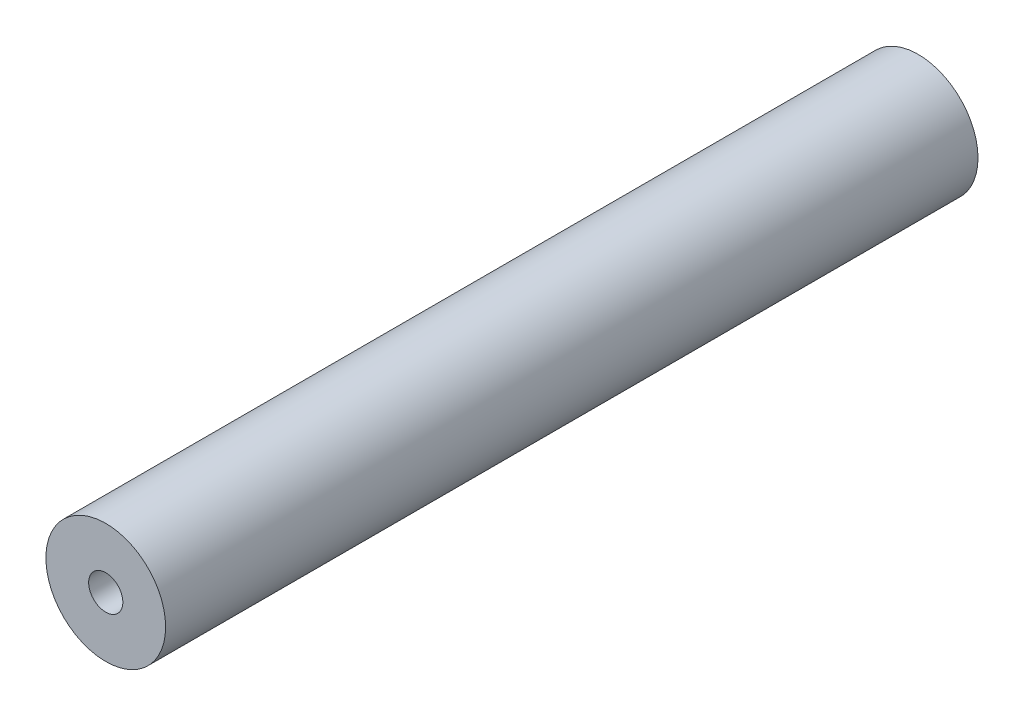
ISO-10303-21;
HEADER;
FILE_DESCRIPTION(('STEP AP214'),'2;1');
FILE_NAME('part.step','',(''),(''),'','','');
FILE_SCHEMA(('AUTOMOTIVE_DESIGN { 1 0 10303 214 1 1 1 1 }'));
ENDSEC;
DATA;
#1=APPLICATION_CONTEXT('core data for automotive mechanical design processes');
#2=APPLICATION_PROTOCOL_DEFINITION('international standard','automotive_design',2000,#1);
#3=PRODUCT_CONTEXT('',#1,'mechanical');
#4=PRODUCT('Part','Part','',(#3));
#5=PRODUCT_RELATED_PRODUCT_CATEGORY('part','',(#4));
#6=PRODUCT_DEFINITION_FORMATION('','',#4);
#7=PRODUCT_DEFINITION_CONTEXT('part definition',#1,'design');
#8=PRODUCT_DEFINITION('design','',#6,#7);
#9=PRODUCT_DEFINITION_SHAPE('','',#8);
#10=(LENGTH_UNIT() NAMED_UNIT(*) SI_UNIT(.MILLI.,.METRE.));
#11=(NAMED_UNIT(*) PLANE_ANGLE_UNIT() SI_UNIT($,.RADIAN.));
#12=(NAMED_UNIT(*) SI_UNIT($,.STERADIAN.) SOLID_ANGLE_UNIT());
#13=UNCERTAINTY_MEASURE_WITH_UNIT(LENGTH_MEASURE(1.E-05),#10,'distance_accuracy_value','');
#14=(GEOMETRIC_REPRESENTATION_CONTEXT(3) GLOBAL_UNCERTAINTY_ASSIGNED_CONTEXT((#13)) GLOBAL_UNIT_ASSIGNED_CONTEXT((#10,
#11,#12)) REPRESENTATION_CONTEXT('',''));
#15=CARTESIAN_POINT('',(0.,0.,0.));
#16=DIRECTION('',(0.,0.,1.));
#17=DIRECTION('',(1.,0.,0.));
#18=AXIS2_PLACEMENT_3D('',#15,#16,#17);
#19=CARTESIAN_POINT('',(0.,0.,95.));
#20=DIRECTION('',(0.,0.,-1.));
#21=DIRECTION('',(-1.,0.,0.));
#22=AXIS2_PLACEMENT_3D('',#19,#20,#21);
#23=CYLINDRICAL_SURFACE('',#22,7.);
#24=CARTESIAN_POINT('',(0.,0.,95.));
#25=DIRECTION('',(0.,0.,1.));
#26=DIRECTION('',(1.,0.,0.));
#27=AXIS2_PLACEMENT_3D('',#24,#25,#26);
#28=CIRCLE('',#27,7.);
#29=CARTESIAN_POINT('',(7.,0.,95.));
#30=VERTEX_POINT('',#29);
#31=EDGE_CURVE('E10',#30,#30,#28,.T.);
#32=ORIENTED_EDGE('',*,*,#31,.F.);
#33=EDGE_LOOP('',(#32));
#34=FACE_BOUND('',#33,.T.);
#35=CARTESIAN_POINT('',(0.,0.,0.));
#36=DIRECTION('',(0.,0.,1.));
#37=DIRECTION('',(1.,0.,0.));
#38=AXIS2_PLACEMENT_3D('',#35,#36,#37);
#39=CIRCLE('',#38,7.);
#40=CARTESIAN_POINT('',(7.,0.,0.));
#41=VERTEX_POINT('',#40);
#42=EDGE_CURVE('E36',#41,#41,#39,.T.);
#43=ORIENTED_EDGE('',*,*,#42,.T.);
#44=EDGE_LOOP('',(#43));
#45=FACE_BOUND('',#44,.T.);
#46=ADVANCED_FACE('F33',(#34,#45),#23,.T.);
#47=CARTESIAN_POINT('',(0.,0.,95.));
#48=DIRECTION('',(0.,0.,1.));
#49=DIRECTION('',(1.,0.,0.));
#50=AXIS2_PLACEMENT_3D('',#47,#48,#49);
#51=PLANE('',#50);
#52=CARTESIAN_POINT('',(0.,0.,95.));
#53=DIRECTION('',(0.,0.,1.));
#54=DIRECTION('',(1.,0.,0.));
#55=AXIS2_PLACEMENT_3D('',#52,#53,#54);
#56=CIRCLE('',#55,2.);
#57=CARTESIAN_POINT('',(2.,0.,95.));
#58=VERTEX_POINT('',#57);
#59=EDGE_CURVE('E45',#58,#58,#56,.T.);
#60=ORIENTED_EDGE('',*,*,#59,.F.);
#61=EDGE_LOOP('',(#60));
#62=FACE_BOUND('',#61,.T.);
#63=ORIENTED_EDGE('',*,*,#31,.T.);
#64=EDGE_LOOP('',(#63));
#65=FACE_BOUND('',#64,.T.);
#66=ADVANCED_FACE('F60',(#62,#65),#51,.T.);
#67=CARTESIAN_POINT('',(0.,0.,0.));
#68=DIRECTION('',(0.,0.,1.));
#69=DIRECTION('',(1.,0.,0.));
#70=AXIS2_PLACEMENT_3D('',#67,#68,#69);
#71=PLANE('',#70);
#72=ORIENTED_EDGE('',*,*,#42,.F.);
#73=EDGE_LOOP('',(#72));
#74=FACE_BOUND('',#73,.T.);
#75=ADVANCED_FACE('F56',(#74),#71,.F.);
#76=CARTESIAN_POINT('',(0.,0.,30.));
#77=DIRECTION('',(0.,0.,1.));
#78=DIRECTION('',(1.,0.,0.));
#79=AXIS2_PLACEMENT_3D('',#76,#77,#78);
#80=CYLINDRICAL_SURFACE('',#79,2.);
#81=CARTESIAN_POINT('',(0.,0.,30.));
#82=DIRECTION('',(0.,0.,1.));
#83=DIRECTION('',(1.,0.,0.));
#84=AXIS2_PLACEMENT_3D('',#81,#82,#83);
#85=CIRCLE('',#84,2.);
#86=CARTESIAN_POINT('',(2.,0.,30.));
#87=VERTEX_POINT('',#86);
#88=EDGE_CURVE('E43',#87,#87,#85,.T.);
#89=ORIENTED_EDGE('',*,*,#88,.F.);
#90=EDGE_LOOP('',(#89));
#91=FACE_BOUND('',#90,.T.);
#92=ORIENTED_EDGE('',*,*,#59,.T.);
#93=EDGE_LOOP('',(#92));
#94=FACE_BOUND('',#93,.T.);
#95=ADVANCED_FACE('F53',(#91,#94),#80,.F.);
#96=CARTESIAN_POINT('',(0.,0.,30.));
#97=DIRECTION('',(0.,0.,1.));
#98=DIRECTION('',(1.,0.,0.));
#99=AXIS2_PLACEMENT_3D('',#96,#97,#98);
#100=PLANE('',#99);
#101=ORIENTED_EDGE('',*,*,#88,.T.);
#102=EDGE_LOOP('',(#101));
#103=FACE_BOUND('',#102,.T.);
#104=ADVANCED_FACE('F51',(#103),#100,.T.);
#105=CLOSED_SHELL('',(#46,#66,#75,#95,#104));
#106=MANIFOLD_SOLID_BREP('B2',#105);
#107=ADVANCED_BREP_SHAPE_REPRESENTATION('',(#18,#106),#14);
#108=SHAPE_DEFINITION_REPRESENTATION(#9,#107);
ENDSEC;
END-ISO-10303-21;
